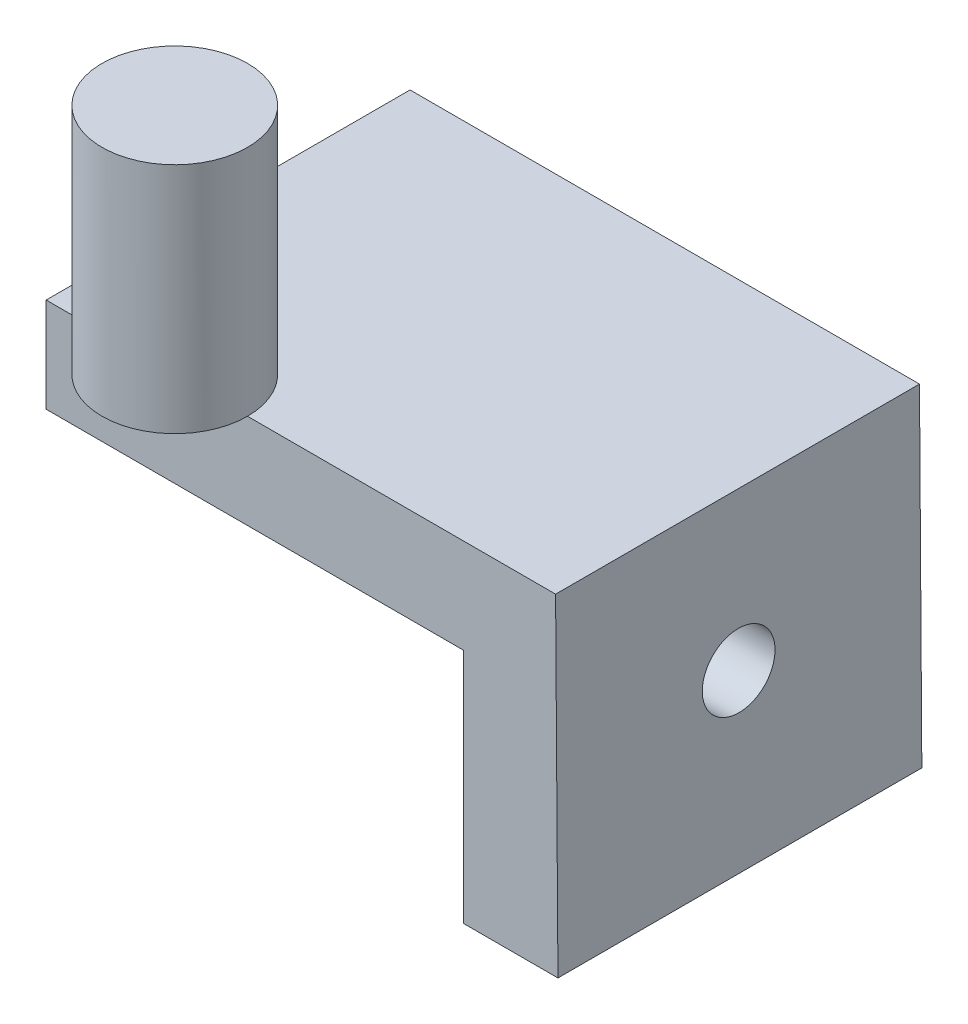
ISO-10303-21;
HEADER;
FILE_DESCRIPTION(('STEP AP214'),'2;1');
FILE_NAME('part.step','',(''),(''),'','','');
FILE_SCHEMA(('AUTOMOTIVE_DESIGN { 1 0 10303 214 1 1 1 1 }'));
ENDSEC;
DATA;
#1=APPLICATION_CONTEXT('core data for automotive mechanical design processes');
#2=APPLICATION_PROTOCOL_DEFINITION('international standard','automotive_design',2000,#1);
#3=PRODUCT_CONTEXT('',#1,'mechanical');
#4=PRODUCT('Part','Part','',(#3));
#5=PRODUCT_RELATED_PRODUCT_CATEGORY('part','',(#4));
#6=PRODUCT_DEFINITION_FORMATION('','',#4);
#7=PRODUCT_DEFINITION_CONTEXT('part definition',#1,'design');
#8=PRODUCT_DEFINITION('design','',#6,#7);
#9=PRODUCT_DEFINITION_SHAPE('','',#8);
#10=(LENGTH_UNIT() NAMED_UNIT(*) SI_UNIT(.MILLI.,.METRE.));
#11=(NAMED_UNIT(*) PLANE_ANGLE_UNIT() SI_UNIT($,.RADIAN.));
#12=(NAMED_UNIT(*) SI_UNIT($,.STERADIAN.) SOLID_ANGLE_UNIT());
#13=UNCERTAINTY_MEASURE_WITH_UNIT(LENGTH_MEASURE(1.E-05),#10,'distance_accuracy_value','');
#14=(GEOMETRIC_REPRESENTATION_CONTEXT(3) GLOBAL_UNCERTAINTY_ASSIGNED_CONTEXT((#13)) GLOBAL_UNIT_ASSIGNED_CONTEXT((#10,
#11,#12)) REPRESENTATION_CONTEXT('',''));
#15=CARTESIAN_POINT('',(0.,0.,0.));
#16=DIRECTION('',(0.,0.,1.));
#17=DIRECTION('',(1.,0.,0.));
#18=AXIS2_PLACEMENT_3D('',#15,#16,#17);
#19=CARTESIAN_POINT('',(-35.1622895751094,0.,12.5));
#20=DIRECTION('',(1.,0.,0.));
#21=DIRECTION('',(0.,0.,-1.));
#22=AXIS2_PLACEMENT_3D('',#19,#20,#21);
#23=PLANE('',#22);
#24=DIRECTION('',(0.,-1.,0.));
#25=VECTOR('',#24,1.);
#26=CARTESIAN_POINT('',(-35.1622895751094,0.,-12.5));
#27=LINE('',#26,#25);
#28=CARTESIAN_POINT('',(-35.1622895751094,0.,-12.5));
#29=VERTEX_POINT('',#28);
#30=CARTESIAN_POINT('',(-35.1622895751094,-6.5,-12.5));
#31=VERTEX_POINT('',#30);
#32=EDGE_CURVE('E139',#29,#31,#27,.T.);
#33=ORIENTED_EDGE('',*,*,#32,.T.);
#34=DIRECTION('',(0.,0.,-1.));
#35=VECTOR('',#34,1.);
#36=CARTESIAN_POINT('',(-35.1622895751094,-6.5,12.5));
#37=LINE('',#36,#35);
#38=CARTESIAN_POINT('',(-35.1622895751094,-6.5,12.5));
#39=VERTEX_POINT('',#38);
#40=EDGE_CURVE('E42',#39,#31,#37,.T.);
#41=ORIENTED_EDGE('',*,*,#40,.F.);
#42=DIRECTION('',(0.,-1.,0.));
#43=VECTOR('',#42,1.);
#44=CARTESIAN_POINT('',(-35.1622895751094,0.,12.5));
#45=LINE('',#44,#43);
#46=CARTESIAN_POINT('',(-35.1622895751094,0.,12.5));
#47=VERTEX_POINT('',#46);
#48=EDGE_CURVE('E151',#47,#39,#45,.T.);
#49=ORIENTED_EDGE('',*,*,#48,.F.);
#50=DIRECTION('',(0.,0.,-1.));
#51=VECTOR('',#50,1.);
#52=CARTESIAN_POINT('',(-35.1622895751094,0.,12.5));
#53=LINE('',#52,#51);
#54=EDGE_CURVE('E138',#47,#29,#53,.T.);
#55=ORIENTED_EDGE('',*,*,#54,.T.);
#56=EDGE_LOOP('',(#33,#41,#49,#55));
#57=FACE_BOUND('',#56,.T.);
#58=ADVANCED_FACE('F39',(#57),#23,.F.);
#59=CARTESIAN_POINT('',(-35.1622895751094,-6.5,12.5));
#60=DIRECTION('',(0.,1.,0.));
#61=DIRECTION('',(0.,0.,1.));
#62=AXIS2_PLACEMENT_3D('',#59,#60,#61);
#63=PLANE('',#62);
#64=DIRECTION('',(1.,0.,0.));
#65=VECTOR('',#64,1.);
#66=CARTESIAN_POINT('',(-35.1622895751094,-6.5,-12.5));
#67=LINE('',#66,#65);
#68=CARTESIAN_POINT('',(-6.5,-6.5,-12.5));
#69=VERTEX_POINT('',#68);
#70=EDGE_CURVE('E142',#31,#69,#67,.T.);
#71=ORIENTED_EDGE('',*,*,#70,.T.);
#72=DIRECTION('',(0.,0.,-1.));
#73=VECTOR('',#72,1.);
#74=CARTESIAN_POINT('',(-6.5,-6.5,12.5));
#75=LINE('',#74,#73);
#76=CARTESIAN_POINT('',(-6.5,-6.5,12.5));
#77=VERTEX_POINT('',#76);
#78=EDGE_CURVE('E154',#77,#69,#75,.T.);
#79=ORIENTED_EDGE('',*,*,#78,.F.);
#80=DIRECTION('',(1.,0.,0.));
#81=VECTOR('',#80,1.);
#82=CARTESIAN_POINT('',(-35.1622895751094,-6.5,12.5));
#83=LINE('',#82,#81);
#84=EDGE_CURVE('E99',#39,#77,#83,.T.);
#85=ORIENTED_EDGE('',*,*,#84,.F.);
#86=ORIENTED_EDGE('',*,*,#40,.T.);
#87=EDGE_LOOP('',(#71,#79,#85,#86));
#88=FACE_BOUND('',#87,.T.);
#89=ADVANCED_FACE('F159',(#88),#63,.F.);
#90=CARTESIAN_POINT('',(-6.5,-6.5,12.5));
#91=DIRECTION('',(1.,0.,0.));
#92=DIRECTION('',(0.,1.,0.));
#93=AXIS2_PLACEMENT_3D('',#90,#91,#92);
#94=PLANE('',#93);
#95=CARTESIAN_POINT('',(-6.5,-10.803604048491,0.));
#96=DIRECTION('',(1.,0.,0.));
#97=DIRECTION('',(0.,1.,0.));
#98=AXIS2_PLACEMENT_3D('',#95,#96,#97);
#99=ELLIPSE('',#98,2.50006356740658,2.5);
#100=CARTESIAN_POINT('',(-6.5,-8.30354048108442,0.));
#101=VERTEX_POINT('',#100);
#102=EDGE_CURVE('E143',#101,#101,#99,.T.);
#103=ORIENTED_EDGE('',*,*,#102,.T.);
#104=EDGE_LOOP('',(#103));
#105=FACE_BOUND('',#104,.T.);
#106=DIRECTION('',(0.,-1.,0.));
#107=VECTOR('',#106,1.);
#108=CARTESIAN_POINT('',(-6.5,-6.5,-12.5));
#109=LINE('',#108,#107);
#110=CARTESIAN_POINT('',(-6.5,-22.7575561175774,-12.5));
#111=VERTEX_POINT('',#110);
#112=EDGE_CURVE('E145',#69,#111,#109,.T.);
#113=ORIENTED_EDGE('',*,*,#112,.T.);
#114=DIRECTION('',(0.,0.,-1.));
#115=VECTOR('',#114,1.);
#116=CARTESIAN_POINT('',(-6.5,-22.7575561175774,12.5));
#117=LINE('',#116,#115);
#118=CARTESIAN_POINT('',(-6.5,-22.7575561175774,12.5));
#119=VERTEX_POINT('',#118);
#120=EDGE_CURVE('E127',#119,#111,#117,.T.);
#121=ORIENTED_EDGE('',*,*,#120,.F.);
#122=DIRECTION('',(0.,-1.,0.));
#123=VECTOR('',#122,1.);
#124=CARTESIAN_POINT('',(-6.5,-6.5,12.5));
#125=LINE('',#124,#123);
#126=EDGE_CURVE('E115',#77,#119,#125,.T.);
#127=ORIENTED_EDGE('',*,*,#126,.F.);
#128=ORIENTED_EDGE('',*,*,#78,.T.);
#129=EDGE_LOOP('',(#113,#121,#127,#128));
#130=FACE_BOUND('',#129,.T.);
#131=ADVANCED_FACE('F165',(#105,#130),#94,.F.);
#132=CARTESIAN_POINT('',(-6.5,-22.7575561175774,12.5));
#133=DIRECTION('',(0.,1.,0.));
#134=DIRECTION('',(0.,0.,1.));
#135=AXIS2_PLACEMENT_3D('',#132,#133,#134);
#136=PLANE('',#135);
#137=DIRECTION('',(1.,0.,0.));
#138=VECTOR('',#137,1.);
#139=CARTESIAN_POINT('',(-6.5,-22.7575561175774,-12.5));
#140=LINE('',#139,#138);
#141=CARTESIAN_POINT('',(0.,-22.7575561175774,-12.5));
#142=VERTEX_POINT('',#141);
#143=EDGE_CURVE('E124',#111,#142,#140,.T.);
#144=ORIENTED_EDGE('',*,*,#143,.T.);
#145=DIRECTION('',(0.,0.,-1.));
#146=VECTOR('',#145,1.);
#147=CARTESIAN_POINT('',(0.,-22.7575561175774,12.5));
#148=LINE('',#147,#146);
#149=CARTESIAN_POINT('',(0.,-22.7575561175774,12.5));
#150=VERTEX_POINT('',#149);
#151=EDGE_CURVE('E121',#150,#142,#148,.T.);
#152=ORIENTED_EDGE('',*,*,#151,.F.);
#153=DIRECTION('',(1.,0.,0.));
#154=VECTOR('',#153,1.);
#155=CARTESIAN_POINT('',(-6.5,-22.7575561175774,12.5));
#156=LINE('',#155,#154);
#157=EDGE_CURVE('E107',#119,#150,#156,.T.);
#158=ORIENTED_EDGE('',*,*,#157,.F.);
#159=ORIENTED_EDGE('',*,*,#120,.T.);
#160=EDGE_LOOP('',(#144,#152,#158,#159));
#161=FACE_BOUND('',#160,.T.);
#162=ADVANCED_FACE('F122',(#161),#136,.F.);
#163=CARTESIAN_POINT('',(0.,-22.7575561175774,12.5));
#164=DIRECTION('',(-0.999974573683883,-0.00713105782733979,0.));
#165=DIRECTION('',(0.00713105782733979,-0.999974573683883,0.));
#166=AXIS2_PLACEMENT_3D('',#163,#164,#165);
#167=PLANE('',#166);
#168=CARTESIAN_POINT('',(-0.0855726939280775,-10.7578612333709,0.));
#169=DIRECTION('',(0.999974573683883,0.0071310578273398,0.));
#170=DIRECTION('',(-0.00713105782733979,0.999974573683883,0.));
#171=AXIS2_PLACEMENT_3D('',#168,#169,#170);
#172=CIRCLE('',#171,2.5);
#173=CARTESIAN_POINT('',(-0.103400338496427,-8.25792479916115,0.));
#174=VERTEX_POINT('',#173);
#175=EDGE_CURVE('E171',#174,#174,#172,.T.);
#176=ORIENTED_EDGE('',*,*,#175,.F.);
#177=EDGE_LOOP('',(#176));
#178=FACE_BOUND('',#177,.T.);
#179=DIRECTION('',(-0.00713105782733979,0.999974573683883,0.));
#180=VECTOR('',#179,1.);
#181=CARTESIAN_POINT('',(0.,-22.7575561175774,-12.5));
#182=LINE('',#181,#180);
#183=CARTESIAN_POINT('',(-0.162289575109414,0.,-12.5));
#184=VERTEX_POINT('',#183);
#185=EDGE_CURVE('E148',#142,#184,#182,.T.);
#186=ORIENTED_EDGE('',*,*,#185,.T.);
#187=DIRECTION('',(0.,0.,-1.));
#188=VECTOR('',#187,1.);
#189=CARTESIAN_POINT('',(-0.162289575109414,0.,12.5));
#190=LINE('',#189,#188);
#191=CARTESIAN_POINT('',(-0.162289575109414,0.,12.5));
#192=VERTEX_POINT('',#191);
#193=EDGE_CURVE('E128',#192,#184,#190,.T.);
#194=ORIENTED_EDGE('',*,*,#193,.F.);
#195=DIRECTION('',(-0.00713105782733979,0.999974573683883,0.));
#196=VECTOR('',#195,1.);
#197=CARTESIAN_POINT('',(0.,-22.7575561175774,12.5));
#198=LINE('',#197,#196);
#199=EDGE_CURVE('E112',#150,#192,#198,.T.);
#200=ORIENTED_EDGE('',*,*,#199,.F.);
#201=ORIENTED_EDGE('',*,*,#151,.T.);
#202=EDGE_LOOP('',(#186,#194,#200,#201));
#203=FACE_BOUND('',#202,.T.);
#204=ADVANCED_FACE('F130',(#178,#203),#167,.F.);
#205=CARTESIAN_POINT('',(-35.1622895751094,0.,12.5));
#206=DIRECTION('',(0.,-1.,0.));
#207=DIRECTION('',(0.,0.,-1.));
#208=AXIS2_PLACEMENT_3D('',#205,#206,#207);
#209=PLANE('',#208);
#210=DIRECTION('',(-1.,0.,0.));
#211=VECTOR('',#210,1.);
#212=CARTESIAN_POINT('',(-35.1622895751094,0.,12.5));
#213=LINE('',#212,#211);
#214=CARTESIAN_POINT('',(-31.3262518534961,0.,12.5));
#215=VERTEX_POINT('',#214);
#216=EDGE_CURVE('E62',#215,#47,#213,.T.);
#217=ORIENTED_EDGE('',*,*,#216,.F.);
#218=CARTESIAN_POINT('',(-26.3262518534961,0.,12.5));
#219=DIRECTION('',(0.,-1.,0.));
#220=DIRECTION('',(0.,0.,-1.));
#221=AXIS2_PLACEMENT_3D('',#218,#219,#220);
#222=CIRCLE('',#221,5.);
#223=CARTESIAN_POINT('',(-21.3262518534961,0.,12.5));
#224=VERTEX_POINT('',#223);
#225=EDGE_CURVE('E11',#215,#224,#222,.T.);
#226=ORIENTED_EDGE('',*,*,#225,.T.);
#227=EDGE_CURVE('E135',#192,#224,#213,.T.);
#228=ORIENTED_EDGE('',*,*,#227,.F.);
#229=ORIENTED_EDGE('',*,*,#193,.T.);
#230=DIRECTION('',(-1.,0.,0.));
#231=VECTOR('',#230,1.);
#232=CARTESIAN_POINT('',(-35.1622895751094,0.,-12.5));
#233=LINE('',#232,#231);
#234=EDGE_CURVE('E90',#184,#29,#233,.T.);
#235=ORIENTED_EDGE('',*,*,#234,.T.);
#236=ORIENTED_EDGE('',*,*,#54,.F.);
#237=EDGE_LOOP('',(#217,#226,#228,#229,#235,#236));
#238=FACE_BOUND('',#237,.T.);
#239=ADVANCED_FACE('F178',(#238),#209,.F.);
#240=CARTESIAN_POINT('',(0.,0.,12.5));
#241=DIRECTION('',(0.,0.,1.));
#242=DIRECTION('',(1.,0.,0.));
#243=AXIS2_PLACEMENT_3D('',#240,#241,#242);
#244=PLANE('',#243);
#245=ORIENTED_EDGE('',*,*,#48,.T.);
#246=ORIENTED_EDGE('',*,*,#84,.T.);
#247=ORIENTED_EDGE('',*,*,#126,.T.);
#248=ORIENTED_EDGE('',*,*,#157,.T.);
#249=ORIENTED_EDGE('',*,*,#199,.T.);
#250=ORIENTED_EDGE('',*,*,#227,.T.);
#251=EDGE_CURVE('E133',#224,#215,#213,.T.);
#252=ORIENTED_EDGE('',*,*,#251,.T.);
#253=ORIENTED_EDGE('',*,*,#216,.T.);
#254=EDGE_LOOP('',(#245,#246,#247,#248,#249,#250,#252,#253));
#255=FACE_BOUND('',#254,.T.);
#256=ADVANCED_FACE('F109',(#255),#244,.T.);
#257=CARTESIAN_POINT('',(0.,0.,-12.5));
#258=DIRECTION('',(0.,0.,1.));
#259=DIRECTION('',(1.,0.,0.));
#260=AXIS2_PLACEMENT_3D('',#257,#258,#259);
#261=PLANE('',#260);
#262=ORIENTED_EDGE('',*,*,#32,.F.);
#263=ORIENTED_EDGE('',*,*,#234,.F.);
#264=ORIENTED_EDGE('',*,*,#185,.F.);
#265=ORIENTED_EDGE('',*,*,#143,.F.);
#266=ORIENTED_EDGE('',*,*,#112,.F.);
#267=ORIENTED_EDGE('',*,*,#70,.F.);
#268=EDGE_LOOP('',(#262,#263,#264,#265,#266,#267));
#269=FACE_BOUND('',#268,.T.);
#270=ADVANCED_FACE('F164',(#269),#261,.F.);
#271=CARTESIAN_POINT('',(-25.0849370360252,-10.9361376790543,0.));
#272=DIRECTION('',(0.999974573683883,0.00713105782733979,0.));
#273=DIRECTION('',(-0.0071310578273398,0.999974573683883,0.));
#274=AXIS2_PLACEMENT_3D('',#271,#272,#273);
#275=CYLINDRICAL_SURFACE('',#274,2.5);
#276=ORIENTED_EDGE('',*,*,#175,.T.);
#277=EDGE_LOOP('',(#276));
#278=FACE_BOUND('',#277,.T.);
#279=ORIENTED_EDGE('',*,*,#102,.F.);
#280=EDGE_LOOP('',(#279));
#281=FACE_BOUND('',#280,.T.);
#282=ADVANCED_FACE('F209',(#278,#281),#275,.F.);
#283=CARTESIAN_POINT('',(-26.3262518534961,0.,12.5));
#284=DIRECTION('',(0.,-1.,0.));
#285=DIRECTION('',(0.,0.,-1.));
#286=AXIS2_PLACEMENT_3D('',#283,#284,#285);
#287=PLANE('',#286);
#288=ORIENTED_EDGE('',*,*,#251,.F.);
#289=EDGE_CURVE('E48',#224,#215,#222,.T.);
#290=ORIENTED_EDGE('',*,*,#289,.T.);
#291=EDGE_LOOP('',(#288,#290));
#292=FACE_BOUND('',#291,.T.);
#293=ADVANCED_FACE('F177',(#292),#287,.T.);
#294=CARTESIAN_POINT('',(-26.3262518534961,16.,12.5));
#295=DIRECTION('',(0.,1.,0.));
#296=DIRECTION('',(0.,0.,1.));
#297=AXIS2_PLACEMENT_3D('',#294,#295,#296);
#298=PLANE('',#297);
#299=CARTESIAN_POINT('',(-26.3262518534961,16.,12.5));
#300=DIRECTION('',(0.,-1.,0.));
#301=DIRECTION('',(0.,0.,-1.));
#302=AXIS2_PLACEMENT_3D('',#299,#300,#301);
#303=CIRCLE('',#302,5.);
#304=CARTESIAN_POINT('',(-26.3262518534961,16.,7.5));
#305=VERTEX_POINT('',#304);
#306=EDGE_CURVE('E174',#305,#305,#303,.T.);
#307=ORIENTED_EDGE('',*,*,#306,.F.);
#308=EDGE_LOOP('',(#307));
#309=FACE_BOUND('',#308,.T.);
#310=ADVANCED_FACE('F181',(#309),#298,.T.);
#311=CARTESIAN_POINT('',(-26.3262518534961,0.,12.5));
#312=DIRECTION('',(0.,-1.,0.));
#313=DIRECTION('',(0.,0.,-1.));
#314=AXIS2_PLACEMENT_3D('',#311,#312,#313);
#315=CYLINDRICAL_SURFACE('',#314,5.);
#316=ORIENTED_EDGE('',*,*,#306,.T.);
#317=EDGE_LOOP('',(#316));
#318=FACE_BOUND('',#317,.T.);
#319=ORIENTED_EDGE('',*,*,#289,.F.);
#320=ORIENTED_EDGE('',*,*,#225,.F.);
#321=EDGE_LOOP('',(#319,#320));
#322=FACE_BOUND('',#321,.T.);
#323=ADVANCED_FACE('F179',(#318,#322),#315,.T.);
#324=CLOSED_SHELL('',(#58,#89,#131,#162,#204,#239,#256,#270,#282,#293,#310,#323));
#325=MANIFOLD_SOLID_BREP('B2',#324);
#326=ADVANCED_BREP_SHAPE_REPRESENTATION('',(#18,#325),#14);
#327=SHAPE_DEFINITION_REPRESENTATION(#9,#326);
ENDSEC;
END-ISO-10303-21;
